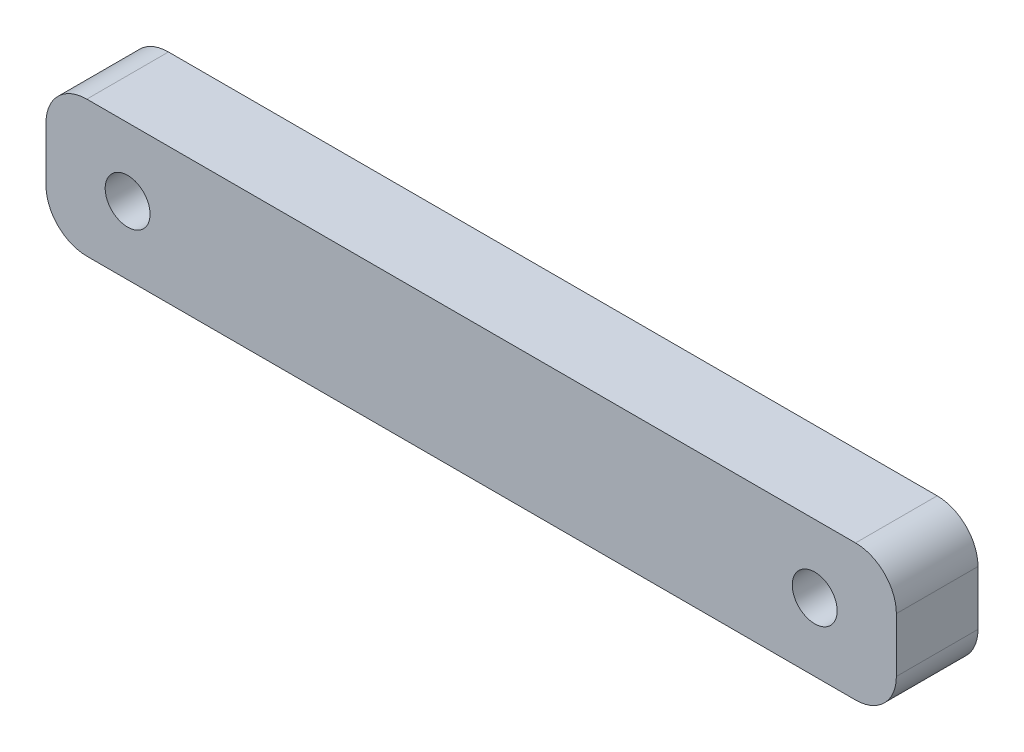
ISO-10303-21;
HEADER;
FILE_DESCRIPTION(('STEP AP214'),'2;1');
FILE_NAME('part.step','',(''),(''),'','','');
FILE_SCHEMA(('AUTOMOTIVE_DESIGN { 1 0 10303 214 1 1 1 1 }'));
ENDSEC;
DATA;
#1=APPLICATION_CONTEXT('core data for automotive mechanical design processes');
#2=APPLICATION_PROTOCOL_DEFINITION('international standard','automotive_design',2000,#1);
#3=PRODUCT_CONTEXT('',#1,'mechanical');
#4=PRODUCT('Part','Part','',(#3));
#5=PRODUCT_RELATED_PRODUCT_CATEGORY('part','',(#4));
#6=PRODUCT_DEFINITION_FORMATION('','',#4);
#7=PRODUCT_DEFINITION_CONTEXT('part definition',#1,'design');
#8=PRODUCT_DEFINITION('design','',#6,#7);
#9=PRODUCT_DEFINITION_SHAPE('','',#8);
#10=(LENGTH_UNIT() NAMED_UNIT(*) SI_UNIT(.MILLI.,.METRE.));
#11=(NAMED_UNIT(*) PLANE_ANGLE_UNIT() SI_UNIT($,.RADIAN.));
#12=(NAMED_UNIT(*) SI_UNIT($,.STERADIAN.) SOLID_ANGLE_UNIT());
#13=UNCERTAINTY_MEASURE_WITH_UNIT(LENGTH_MEASURE(1.E-05),#10,'distance_accuracy_value','');
#14=(GEOMETRIC_REPRESENTATION_CONTEXT(3) GLOBAL_UNCERTAINTY_ASSIGNED_CONTEXT((#13)) GLOBAL_UNIT_ASSIGNED_CONTEXT((#10,
#11,#12)) REPRESENTATION_CONTEXT('',''));
#15=CARTESIAN_POINT('',(0.,0.,0.));
#16=DIRECTION('',(0.,0.,1.));
#17=DIRECTION('',(1.,0.,0.));
#18=AXIS2_PLACEMENT_3D('',#15,#16,#17);
#19=CARTESIAN_POINT('',(0.,0.,6.));
#20=DIRECTION('',(1.,0.,0.));
#21=DIRECTION('',(0.,0.,-1.));
#22=AXIS2_PLACEMENT_3D('',#19,#20,#21);
#23=PLANE('',#22);
#24=DIRECTION('',(0.,-1.,0.));
#25=VECTOR('',#24,1.);
#26=CARTESIAN_POINT('',(0.,0.,0.));
#27=LINE('',#26,#25);
#28=CARTESIAN_POINT('',(0.,-3.,0.));
#29=VERTEX_POINT('',#28);
#30=CARTESIAN_POINT('',(0.,-7.,0.));
#31=VERTEX_POINT('',#30);
#32=EDGE_CURVE('E129',#29,#31,#27,.T.);
#33=ORIENTED_EDGE('',*,*,#32,.T.);
#34=DIRECTION('',(0.,0.,-1.));
#35=VECTOR('',#34,1.);
#36=CARTESIAN_POINT('',(0.,-7.,6.));
#37=LINE('',#36,#35);
#38=CARTESIAN_POINT('',(0.,-7.,6.));
#39=VERTEX_POINT('',#38);
#40=EDGE_CURVE('E11',#31,#39,#37,.F.);
#41=ORIENTED_EDGE('',*,*,#40,.T.);
#42=DIRECTION('',(0.,-1.,0.));
#43=VECTOR('',#42,1.);
#44=CARTESIAN_POINT('',(0.,0.,6.));
#45=LINE('',#44,#43);
#46=CARTESIAN_POINT('',(0.,-3.,6.));
#47=VERTEX_POINT('',#46);
#48=EDGE_CURVE('E127',#47,#39,#45,.T.);
#49=ORIENTED_EDGE('',*,*,#48,.F.);
#50=DIRECTION('',(0.,0.,-1.));
#51=VECTOR('',#50,1.);
#52=CARTESIAN_POINT('',(0.,-3.,6.));
#53=LINE('',#52,#51);
#54=EDGE_CURVE('E41',#47,#29,#53,.T.);
#55=ORIENTED_EDGE('',*,*,#54,.T.);
#56=EDGE_LOOP('',(#33,#41,#49,#55));
#57=FACE_BOUND('',#56,.T.);
#58=ADVANCED_FACE('F33',(#57),#23,.F.);
#59=CARTESIAN_POINT('',(0.,-10.,6.));
#60=DIRECTION('',(0.,1.,0.));
#61=DIRECTION('',(0.,0.,1.));
#62=AXIS2_PLACEMENT_3D('',#59,#60,#61);
#63=PLANE('',#62);
#64=DIRECTION('',(1.,0.,0.));
#65=VECTOR('',#64,1.);
#66=CARTESIAN_POINT('',(0.,-10.,0.));
#67=LINE('',#66,#65);
#68=CARTESIAN_POINT('',(3.,-10.,0.));
#69=VERTEX_POINT('',#68);
#70=CARTESIAN_POINT('',(59.5,-10.,0.));
#71=VERTEX_POINT('',#70);
#72=EDGE_CURVE('E125',#69,#71,#67,.T.);
#73=ORIENTED_EDGE('',*,*,#72,.T.);
#74=DIRECTION('',(0.,0.,-1.));
#75=VECTOR('',#74,1.);
#76=CARTESIAN_POINT('',(59.5,-10.,6.));
#77=LINE('',#76,#75);
#78=CARTESIAN_POINT('',(59.5,-10.,6.));
#79=VERTEX_POINT('',#78);
#80=EDGE_CURVE('E104',#71,#79,#77,.F.);
#81=ORIENTED_EDGE('',*,*,#80,.T.);
#82=DIRECTION('',(1.,0.,0.));
#83=VECTOR('',#82,1.);
#84=CARTESIAN_POINT('',(0.,-10.,6.));
#85=LINE('',#84,#83);
#86=CARTESIAN_POINT('',(3.,-10.,6.));
#87=VERTEX_POINT('',#86);
#88=EDGE_CURVE('E169',#87,#79,#85,.T.);
#89=ORIENTED_EDGE('',*,*,#88,.F.);
#90=DIRECTION('',(0.,0.,-1.));
#91=VECTOR('',#90,1.);
#92=CARTESIAN_POINT('',(3.,-10.,6.));
#93=LINE('',#92,#91);
#94=EDGE_CURVE('E109',#87,#69,#93,.T.);
#95=ORIENTED_EDGE('',*,*,#94,.T.);
#96=EDGE_LOOP('',(#73,#81,#89,#95));
#97=FACE_BOUND('',#96,.T.);
#98=ADVANCED_FACE('F201',(#97),#63,.F.);
#99=CARTESIAN_POINT('',(62.5,0.,6.));
#100=DIRECTION('',(-1.,0.,0.));
#101=DIRECTION('',(0.,0.,1.));
#102=AXIS2_PLACEMENT_3D('',#99,#100,#101);
#103=PLANE('',#102);
#104=DIRECTION('',(0.,1.,0.));
#105=VECTOR('',#104,1.);
#106=CARTESIAN_POINT('',(62.5,0.,6.));
#107=LINE('',#106,#105);
#108=CARTESIAN_POINT('',(62.5,-7.,6.));
#109=VERTEX_POINT('',#108);
#110=CARTESIAN_POINT('',(62.5,-3.,6.));
#111=VERTEX_POINT('',#110);
#112=EDGE_CURVE('E118',#109,#111,#107,.T.);
#113=ORIENTED_EDGE('',*,*,#112,.F.);
#114=DIRECTION('',(0.,0.,-1.));
#115=VECTOR('',#114,1.);
#116=CARTESIAN_POINT('',(62.5,-7.,6.));
#117=LINE('',#116,#115);
#118=CARTESIAN_POINT('',(62.5,-7.,0.));
#119=VERTEX_POINT('',#118);
#120=EDGE_CURVE('E103',#109,#119,#117,.T.);
#121=ORIENTED_EDGE('',*,*,#120,.T.);
#122=DIRECTION('',(0.,1.,0.));
#123=VECTOR('',#122,1.);
#124=CARTESIAN_POINT('',(62.5,0.,0.));
#125=LINE('',#124,#123);
#126=CARTESIAN_POINT('',(62.5,-3.,0.));
#127=VERTEX_POINT('',#126);
#128=EDGE_CURVE('E116',#119,#127,#125,.T.);
#129=ORIENTED_EDGE('',*,*,#128,.T.);
#130=DIRECTION('',(0.,0.,-1.));
#131=VECTOR('',#130,1.);
#132=CARTESIAN_POINT('',(62.5,-3.,6.));
#133=LINE('',#132,#131);
#134=EDGE_CURVE('E120',#127,#111,#133,.F.);
#135=ORIENTED_EDGE('',*,*,#134,.T.);
#136=EDGE_LOOP('',(#113,#121,#129,#135));
#137=FACE_BOUND('',#136,.T.);
#138=ADVANCED_FACE('F115',(#137),#103,.F.);
#139=CARTESIAN_POINT('',(0.,0.,6.));
#140=DIRECTION('',(0.,-1.,0.));
#141=DIRECTION('',(0.,0.,-1.));
#142=AXIS2_PLACEMENT_3D('',#139,#140,#141);
#143=PLANE('',#142);
#144=DIRECTION('',(-1.,0.,0.));
#145=VECTOR('',#144,1.);
#146=CARTESIAN_POINT('',(0.,0.,6.));
#147=LINE('',#146,#145);
#148=CARTESIAN_POINT('',(59.5,0.,6.));
#149=VERTEX_POINT('',#148);
#150=CARTESIAN_POINT('',(3.,0.,6.));
#151=VERTEX_POINT('',#150);
#152=EDGE_CURVE('E133',#149,#151,#147,.T.);
#153=ORIENTED_EDGE('',*,*,#152,.F.);
#154=DIRECTION('',(0.,0.,-1.));
#155=VECTOR('',#154,1.);
#156=CARTESIAN_POINT('',(59.5,0.,6.));
#157=LINE('',#156,#155);
#158=CARTESIAN_POINT('',(59.5,0.,0.));
#159=VERTEX_POINT('',#158);
#160=EDGE_CURVE('E150',#149,#159,#157,.T.);
#161=ORIENTED_EDGE('',*,*,#160,.T.);
#162=DIRECTION('',(-1.,0.,0.));
#163=VECTOR('',#162,1.);
#164=CARTESIAN_POINT('',(0.,0.,0.));
#165=LINE('',#164,#163);
#166=CARTESIAN_POINT('',(3.,0.,0.));
#167=VERTEX_POINT('',#166);
#168=EDGE_CURVE('E124',#159,#167,#165,.T.);
#169=ORIENTED_EDGE('',*,*,#168,.T.);
#170=DIRECTION('',(0.,0.,-1.));
#171=VECTOR('',#170,1.);
#172=CARTESIAN_POINT('',(3.,0.,6.));
#173=LINE('',#172,#171);
#174=EDGE_CURVE('E48',#167,#151,#173,.F.);
#175=ORIENTED_EDGE('',*,*,#174,.T.);
#176=EDGE_LOOP('',(#153,#161,#169,#175));
#177=FACE_BOUND('',#176,.T.);
#178=ADVANCED_FACE('F194',(#177),#143,.F.);
#179=CARTESIAN_POINT('',(0.,0.,6.));
#180=DIRECTION('',(0.,0.,1.));
#181=DIRECTION('',(1.,0.,0.));
#182=AXIS2_PLACEMENT_3D('',#179,#180,#181);
#183=PLANE('',#182);
#184=CARTESIAN_POINT('',(6.,-5.,6.));
#185=DIRECTION('',(0.,0.,1.));
#186=DIRECTION('',(1.,0.,0.));
#187=AXIS2_PLACEMENT_3D('',#184,#185,#186);
#188=CIRCLE('',#187,1.65);
#189=CARTESIAN_POINT('',(7.65,-5.,6.));
#190=VERTEX_POINT('',#189);
#191=EDGE_CURVE('E176',#190,#190,#188,.T.);
#192=ORIENTED_EDGE('',*,*,#191,.F.);
#193=EDGE_LOOP('',(#192));
#194=FACE_BOUND('',#193,.T.);
#195=CARTESIAN_POINT('',(56.5,-5.,6.));
#196=DIRECTION('',(0.,0.,1.));
#197=DIRECTION('',(1.,0.,0.));
#198=AXIS2_PLACEMENT_3D('',#195,#196,#197);
#199=CIRCLE('',#198,1.65);
#200=CARTESIAN_POINT('',(58.15,-5.,6.));
#201=VERTEX_POINT('',#200);
#202=EDGE_CURVE('E164',#201,#201,#199,.T.);
#203=ORIENTED_EDGE('',*,*,#202,.F.);
#204=EDGE_LOOP('',(#203));
#205=FACE_BOUND('',#204,.T.);
#206=ORIENTED_EDGE('',*,*,#88,.T.);
#207=CARTESIAN_POINT('',(59.5,-7.,6.));
#208=DIRECTION('',(0.,0.,1.));
#209=DIRECTION('',(1.,0.,0.));
#210=AXIS2_PLACEMENT_3D('',#207,#208,#209);
#211=CIRCLE('',#210,3.);
#212=EDGE_CURVE('E147',#79,#109,#211,.T.);
#213=ORIENTED_EDGE('',*,*,#212,.T.);
#214=ORIENTED_EDGE('',*,*,#112,.T.);
#215=CARTESIAN_POINT('',(59.5,-3.,6.));
#216=DIRECTION('',(0.,0.,1.));
#217=DIRECTION('',(1.,0.,0.));
#218=AXIS2_PLACEMENT_3D('',#215,#216,#217);
#219=CIRCLE('',#218,3.);
#220=EDGE_CURVE('E55',#111,#149,#219,.T.);
#221=ORIENTED_EDGE('',*,*,#220,.T.);
#222=ORIENTED_EDGE('',*,*,#152,.T.);
#223=CARTESIAN_POINT('',(3.,-3.,6.));
#224=DIRECTION('',(0.,0.,1.));
#225=DIRECTION('',(1.,0.,0.));
#226=AXIS2_PLACEMENT_3D('',#223,#224,#225);
#227=CIRCLE('',#226,3.);
#228=EDGE_CURVE('E142',#151,#47,#227,.T.);
#229=ORIENTED_EDGE('',*,*,#228,.T.);
#230=ORIENTED_EDGE('',*,*,#48,.T.);
#231=CARTESIAN_POINT('',(3.,-7.,6.));
#232=DIRECTION('',(0.,0.,1.));
#233=DIRECTION('',(1.,0.,0.));
#234=AXIS2_PLACEMENT_3D('',#231,#232,#233);
#235=CIRCLE('',#234,3.);
#236=EDGE_CURVE('E144',#39,#87,#235,.T.);
#237=ORIENTED_EDGE('',*,*,#236,.T.);
#238=EDGE_LOOP('',(#206,#213,#214,#221,#222,#229,#230,#237));
#239=FACE_BOUND('',#238,.T.);
#240=ADVANCED_FACE('F191',(#194,#205,#239),#183,.T.);
#241=CARTESIAN_POINT('',(0.,0.,0.));
#242=DIRECTION('',(0.,0.,1.));
#243=DIRECTION('',(1.,0.,0.));
#244=AXIS2_PLACEMENT_3D('',#241,#242,#243);
#245=PLANE('',#244);
#246=CARTESIAN_POINT('',(6.,-5.,0.));
#247=DIRECTION('',(0.,0.,1.));
#248=DIRECTION('',(1.,0.,0.));
#249=AXIS2_PLACEMENT_3D('',#246,#247,#248);
#250=CIRCLE('',#249,1.65);
#251=CARTESIAN_POINT('',(7.65,-5.,0.));
#252=VERTEX_POINT('',#251);
#253=EDGE_CURVE('E174',#252,#252,#250,.T.);
#254=ORIENTED_EDGE('',*,*,#253,.T.);
#255=EDGE_LOOP('',(#254));
#256=FACE_BOUND('',#255,.T.);
#257=CARTESIAN_POINT('',(56.5,-5.,0.));
#258=DIRECTION('',(0.,0.,1.));
#259=DIRECTION('',(1.,0.,0.));
#260=AXIS2_PLACEMENT_3D('',#257,#258,#259);
#261=CIRCLE('',#260,1.65);
#262=CARTESIAN_POINT('',(58.15,-5.,0.));
#263=VERTEX_POINT('',#262);
#264=EDGE_CURVE('E162',#263,#263,#261,.T.);
#265=ORIENTED_EDGE('',*,*,#264,.T.);
#266=EDGE_LOOP('',(#265));
#267=FACE_BOUND('',#266,.T.);
#268=ORIENTED_EDGE('',*,*,#128,.F.);
#269=CARTESIAN_POINT('',(59.5,-7.,0.));
#270=DIRECTION('',(0.,0.,1.));
#271=DIRECTION('',(1.,0.,0.));
#272=AXIS2_PLACEMENT_3D('',#269,#270,#271);
#273=CIRCLE('',#272,3.);
#274=EDGE_CURVE('E99',#119,#71,#273,.F.);
#275=ORIENTED_EDGE('',*,*,#274,.T.);
#276=ORIENTED_EDGE('',*,*,#72,.F.);
#277=CARTESIAN_POINT('',(3.,-7.,0.));
#278=DIRECTION('',(0.,0.,1.));
#279=DIRECTION('',(1.,0.,0.));
#280=AXIS2_PLACEMENT_3D('',#277,#278,#279);
#281=CIRCLE('',#280,3.);
#282=EDGE_CURVE('E136',#69,#31,#281,.F.);
#283=ORIENTED_EDGE('',*,*,#282,.T.);
#284=ORIENTED_EDGE('',*,*,#32,.F.);
#285=CARTESIAN_POINT('',(3.,-3.,0.));
#286=DIRECTION('',(0.,0.,1.));
#287=DIRECTION('',(1.,0.,0.));
#288=AXIS2_PLACEMENT_3D('',#285,#286,#287);
#289=CIRCLE('',#288,3.);
#290=EDGE_CURVE('E119',#29,#167,#289,.F.);
#291=ORIENTED_EDGE('',*,*,#290,.T.);
#292=ORIENTED_EDGE('',*,*,#168,.F.);
#293=CARTESIAN_POINT('',(59.5,-3.,0.));
#294=DIRECTION('',(0.,0.,1.));
#295=DIRECTION('',(1.,0.,0.));
#296=AXIS2_PLACEMENT_3D('',#293,#294,#295);
#297=CIRCLE('',#296,3.);
#298=EDGE_CURVE('E110',#159,#127,#297,.F.);
#299=ORIENTED_EDGE('',*,*,#298,.T.);
#300=EDGE_LOOP('',(#268,#275,#276,#283,#284,#291,#292,#299));
#301=FACE_BOUND('',#300,.T.);
#302=ADVANCED_FACE('F122',(#256,#267,#301),#245,.F.);
#303=CARTESIAN_POINT('',(56.5,-5.,0.));
#304=DIRECTION('',(0.,0.,1.));
#305=DIRECTION('',(1.,0.,0.));
#306=AXIS2_PLACEMENT_3D('',#303,#304,#305);
#307=CYLINDRICAL_SURFACE('',#306,1.65);
#308=ORIENTED_EDGE('',*,*,#264,.F.);
#309=EDGE_LOOP('',(#308));
#310=FACE_BOUND('',#309,.T.);
#311=ORIENTED_EDGE('',*,*,#202,.T.);
#312=EDGE_LOOP('',(#311));
#313=FACE_BOUND('',#312,.T.);
#314=ADVANCED_FACE('F187',(#310,#313),#307,.F.);
#315=CARTESIAN_POINT('',(6.,-5.,0.));
#316=DIRECTION('',(0.,0.,1.));
#317=DIRECTION('',(1.,0.,0.));
#318=AXIS2_PLACEMENT_3D('',#315,#316,#317);
#319=CYLINDRICAL_SURFACE('',#318,1.65);
#320=ORIENTED_EDGE('',*,*,#253,.F.);
#321=EDGE_LOOP('',(#320));
#322=FACE_BOUND('',#321,.T.);
#323=ORIENTED_EDGE('',*,*,#191,.T.);
#324=EDGE_LOOP('',(#323));
#325=FACE_BOUND('',#324,.T.);
#326=ADVANCED_FACE('F184',(#322,#325),#319,.F.);
#327=CARTESIAN_POINT('',(59.5,-7.,6.));
#328=DIRECTION('',(0.,0.,-1.));
#329=DIRECTION('',(-1.,0.,0.));
#330=AXIS2_PLACEMENT_3D('',#327,#328,#329);
#331=CYLINDRICAL_SURFACE('',#330,3.);
#332=ORIENTED_EDGE('',*,*,#212,.F.);
#333=ORIENTED_EDGE('',*,*,#80,.F.);
#334=ORIENTED_EDGE('',*,*,#274,.F.);
#335=ORIENTED_EDGE('',*,*,#120,.F.);
#336=EDGE_LOOP('',(#332,#333,#334,#335));
#337=FACE_BOUND('',#336,.T.);
#338=ADVANCED_FACE('F102',(#337),#331,.T.);
#339=CARTESIAN_POINT('',(59.5,-3.,6.));
#340=DIRECTION('',(0.,0.,-1.));
#341=DIRECTION('',(-1.,0.,0.));
#342=AXIS2_PLACEMENT_3D('',#339,#340,#341);
#343=CYLINDRICAL_SURFACE('',#342,3.);
#344=ORIENTED_EDGE('',*,*,#220,.F.);
#345=ORIENTED_EDGE('',*,*,#134,.F.);
#346=ORIENTED_EDGE('',*,*,#298,.F.);
#347=ORIENTED_EDGE('',*,*,#160,.F.);
#348=EDGE_LOOP('',(#344,#345,#346,#347));
#349=FACE_BOUND('',#348,.T.);
#350=ADVANCED_FACE('F208',(#349),#343,.T.);
#351=CARTESIAN_POINT('',(3.,-7.,6.));
#352=DIRECTION('',(0.,0.,-1.));
#353=DIRECTION('',(-1.,0.,0.));
#354=AXIS2_PLACEMENT_3D('',#351,#352,#353);
#355=CYLINDRICAL_SURFACE('',#354,3.);
#356=ORIENTED_EDGE('',*,*,#236,.F.);
#357=ORIENTED_EDGE('',*,*,#40,.F.);
#358=ORIENTED_EDGE('',*,*,#282,.F.);
#359=ORIENTED_EDGE('',*,*,#94,.F.);
#360=EDGE_LOOP('',(#356,#357,#358,#359));
#361=FACE_BOUND('',#360,.T.);
#362=ADVANCED_FACE('F203',(#361),#355,.T.);
#363=CARTESIAN_POINT('',(3.,-3.,6.));
#364=DIRECTION('',(0.,0.,-1.));
#365=DIRECTION('',(-1.,0.,0.));
#366=AXIS2_PLACEMENT_3D('',#363,#364,#365);
#367=CYLINDRICAL_SURFACE('',#366,3.);
#368=ORIENTED_EDGE('',*,*,#228,.F.);
#369=ORIENTED_EDGE('',*,*,#174,.F.);
#370=ORIENTED_EDGE('',*,*,#290,.F.);
#371=ORIENTED_EDGE('',*,*,#54,.F.);
#372=EDGE_LOOP('',(#368,#369,#370,#371));
#373=FACE_BOUND('',#372,.T.);
#374=ADVANCED_FACE('F35',(#373),#367,.T.);
#375=CLOSED_SHELL('',(#58,#98,#138,#178,#240,#302,#314,#326,#338,#350,#362,#374));
#376=MANIFOLD_SOLID_BREP('B2',#375);
#377=ADVANCED_BREP_SHAPE_REPRESENTATION('',(#18,#376),#14);
#378=SHAPE_DEFINITION_REPRESENTATION(#9,#377);
ENDSEC;
END-ISO-10303-21;
